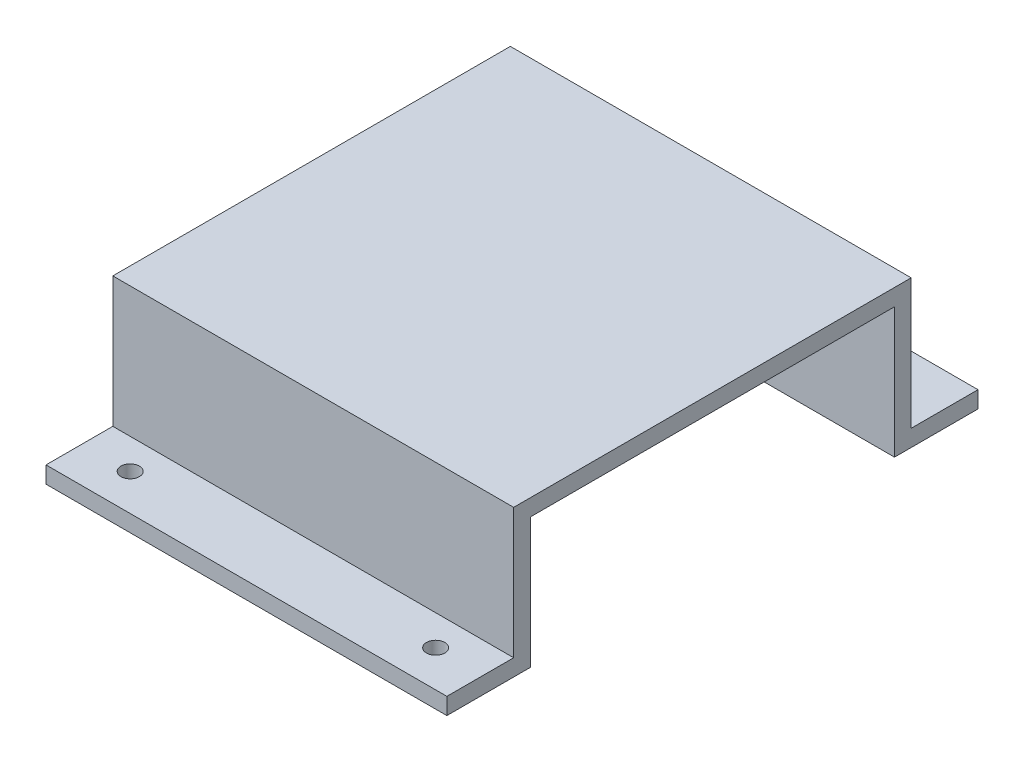
ISO-10303-21;
HEADER;
FILE_DESCRIPTION(('STEP AP214'),'2;1');
FILE_NAME('part.step','',(''),(''),'','','');
FILE_SCHEMA(('AUTOMOTIVE_DESIGN { 1 0 10303 214 1 1 1 1 }'));
ENDSEC;
DATA;
#1=APPLICATION_CONTEXT('core data for automotive mechanical design processes');
#2=APPLICATION_PROTOCOL_DEFINITION('international standard','automotive_design',2000,#1);
#3=PRODUCT_CONTEXT('',#1,'mechanical');
#4=PRODUCT('Part','Part','',(#3));
#5=PRODUCT_RELATED_PRODUCT_CATEGORY('part','',(#4));
#6=PRODUCT_DEFINITION_FORMATION('','',#4);
#7=PRODUCT_DEFINITION_CONTEXT('part definition',#1,'design');
#8=PRODUCT_DEFINITION('design','',#6,#7);
#9=PRODUCT_DEFINITION_SHAPE('','',#8);
#10=(LENGTH_UNIT() NAMED_UNIT(*) SI_UNIT(.MILLI.,.METRE.));
#11=(NAMED_UNIT(*) PLANE_ANGLE_UNIT() SI_UNIT($,.RADIAN.));
#12=(NAMED_UNIT(*) SI_UNIT($,.STERADIAN.) SOLID_ANGLE_UNIT());
#13=UNCERTAINTY_MEASURE_WITH_UNIT(LENGTH_MEASURE(1.E-05),#10,'distance_accuracy_value','');
#14=(GEOMETRIC_REPRESENTATION_CONTEXT(3) GLOBAL_UNCERTAINTY_ASSIGNED_CONTEXT((#13)) GLOBAL_UNIT_ASSIGNED_CONTEXT((#10,
#11,#12)) REPRESENTATION_CONTEXT('',''));
#15=CARTESIAN_POINT('',(0.,0.,0.));
#16=DIRECTION('',(0.,0.,1.));
#17=DIRECTION('',(1.,0.,0.));
#18=AXIS2_PLACEMENT_3D('',#15,#16,#17);
#19=CARTESIAN_POINT('',(60.,39.,54.5));
#20=DIRECTION('',(0.,0.,1.));
#21=DIRECTION('',(0.,-1.,0.));
#22=AXIS2_PLACEMENT_3D('',#19,#20,#21);
#23=PLANE('',#22);
#24=DIRECTION('',(0.,1.,0.));
#25=VECTOR('',#24,1.);
#26=CARTESIAN_POINT('',(-60.,39.,54.5));
#27=LINE('',#26,#25);
#28=CARTESIAN_POINT('',(-60.,0.,54.5));
#29=VERTEX_POINT('',#28);
#30=CARTESIAN_POINT('',(-60.,39.,54.5));
#31=VERTEX_POINT('',#30);
#32=EDGE_CURVE('E161',#29,#31,#27,.T.);
#33=ORIENTED_EDGE('',*,*,#32,.T.);
#34=DIRECTION('',(-1.,0.,0.));
#35=VECTOR('',#34,1.);
#36=CARTESIAN_POINT('',(60.,39.,54.5));
#37=LINE('',#36,#35);
#38=CARTESIAN_POINT('',(60.,39.,54.5));
#39=VERTEX_POINT('',#38);
#40=EDGE_CURVE('E11',#39,#31,#37,.T.);
#41=ORIENTED_EDGE('',*,*,#40,.F.);
#42=DIRECTION('',(0.,1.,0.));
#43=VECTOR('',#42,1.);
#44=CARTESIAN_POINT('',(60.,39.,54.5));
#45=LINE('',#44,#43);
#46=CARTESIAN_POINT('',(60.,0.,54.5));
#47=VERTEX_POINT('',#46);
#48=EDGE_CURVE('E183',#47,#39,#45,.T.);
#49=ORIENTED_EDGE('',*,*,#48,.F.);
#50=DIRECTION('',(-1.,0.,0.));
#51=VECTOR('',#50,1.);
#52=CARTESIAN_POINT('',(60.,0.,54.5));
#53=LINE('',#52,#51);
#54=EDGE_CURVE('E160',#47,#29,#53,.T.);
#55=ORIENTED_EDGE('',*,*,#54,.T.);
#56=EDGE_LOOP('',(#33,#41,#49,#55));
#57=FACE_BOUND('',#56,.T.);
#58=ADVANCED_FACE('F41',(#57),#23,.F.);
#59=CARTESIAN_POINT('',(60.,39.,0.));
#60=DIRECTION('',(0.,1.,0.));
#61=DIRECTION('',(0.,0.,1.));
#62=AXIS2_PLACEMENT_3D('',#59,#60,#61);
#63=PLANE('',#62);
#64=DIRECTION('',(0.,0.,-1.));
#65=VECTOR('',#64,1.);
#66=CARTESIAN_POINT('',(-60.,39.,0.));
#67=LINE('',#66,#65);
#68=CARTESIAN_POINT('',(-60.,39.,-54.5));
#69=VERTEX_POINT('',#68);
#70=EDGE_CURVE('E163',#31,#69,#67,.T.);
#71=ORIENTED_EDGE('',*,*,#70,.T.);
#72=DIRECTION('',(-1.,0.,0.));
#73=VECTOR('',#72,1.);
#74=CARTESIAN_POINT('',(60.,39.,-54.5));
#75=LINE('',#74,#73);
#76=CARTESIAN_POINT('',(60.,39.,-54.5));
#77=VERTEX_POINT('',#76);
#78=EDGE_CURVE('E47',#77,#69,#75,.T.);
#79=ORIENTED_EDGE('',*,*,#78,.F.);
#80=DIRECTION('',(0.,0.,-1.));
#81=VECTOR('',#80,1.);
#82=CARTESIAN_POINT('',(60.,39.,0.));
#83=LINE('',#82,#81);
#84=EDGE_CURVE('E115',#39,#77,#83,.T.);
#85=ORIENTED_EDGE('',*,*,#84,.F.);
#86=ORIENTED_EDGE('',*,*,#40,.T.);
#87=EDGE_LOOP('',(#71,#79,#85,#86));
#88=FACE_BOUND('',#87,.T.);
#89=ADVANCED_FACE('F270',(#88),#63,.F.);
#90=CARTESIAN_POINT('',(60.,39.,-54.5));
#91=DIRECTION('',(0.,0.,-1.));
#92=DIRECTION('',(0.,1.,0.));
#93=AXIS2_PLACEMENT_3D('',#90,#91,#92);
#94=PLANE('',#93);
#95=DIRECTION('',(0.,-1.,0.));
#96=VECTOR('',#95,1.);
#97=CARTESIAN_POINT('',(-60.,39.,-54.5));
#98=LINE('',#97,#96);
#99=CARTESIAN_POINT('',(-60.,0.,-54.5));
#100=VERTEX_POINT('',#99);
#101=EDGE_CURVE('E170',#69,#100,#98,.T.);
#102=ORIENTED_EDGE('',*,*,#101,.T.);
#103=DIRECTION('',(-1.,0.,0.));
#104=VECTOR('',#103,1.);
#105=CARTESIAN_POINT('',(60.,0.,-54.5));
#106=LINE('',#105,#104);
#107=CARTESIAN_POINT('',(60.,0.,-54.5));
#108=VERTEX_POINT('',#107);
#109=EDGE_CURVE('E204',#108,#100,#106,.T.);
#110=ORIENTED_EDGE('',*,*,#109,.F.);
#111=DIRECTION('',(0.,-1.,0.));
#112=VECTOR('',#111,1.);
#113=CARTESIAN_POINT('',(60.,39.,-54.5));
#114=LINE('',#113,#112);
#115=EDGE_CURVE('E215',#77,#108,#114,.T.);
#116=ORIENTED_EDGE('',*,*,#115,.F.);
#117=ORIENTED_EDGE('',*,*,#78,.T.);
#118=EDGE_LOOP('',(#102,#110,#116,#117));
#119=FACE_BOUND('',#118,.T.);
#120=ADVANCED_FACE('F209',(#119),#94,.F.);
#121=CARTESIAN_POINT('',(60.,0.,-54.5));
#122=DIRECTION('',(0.,1.,0.));
#123=DIRECTION('',(0.,0.,1.));
#124=AXIS2_PLACEMENT_3D('',#121,#122,#123);
#125=PLANE('',#124);
#126=CARTESIAN_POINT('',(45.72,0.,-68.58));
#127=DIRECTION('',(0.,1.,0.));
#128=DIRECTION('',(0.,0.,1.));
#129=AXIS2_PLACEMENT_3D('',#126,#127,#128);
#130=CIRCLE('',#129,2.74999999999997);
#131=CARTESIAN_POINT('',(45.72,0.,-65.83));
#132=VERTEX_POINT('',#131);
#133=EDGE_CURVE('E315',#132,#132,#130,.T.);
#134=ORIENTED_EDGE('',*,*,#133,.T.);
#135=EDGE_LOOP('',(#134));
#136=FACE_BOUND('',#135,.T.);
#137=CARTESIAN_POINT('',(-45.72,0.,-68.58));
#138=DIRECTION('',(0.,1.,0.));
#139=DIRECTION('',(0.,0.,1.));
#140=AXIS2_PLACEMENT_3D('',#137,#138,#139);
#141=CIRCLE('',#140,2.74999999999997);
#142=CARTESIAN_POINT('',(-45.72,0.,-65.83));
#143=VERTEX_POINT('',#142);
#144=EDGE_CURVE('E318',#143,#143,#141,.T.);
#145=ORIENTED_EDGE('',*,*,#144,.T.);
#146=EDGE_LOOP('',(#145));
#147=FACE_BOUND('',#146,.T.);
#148=DIRECTION('',(0.,0.,-1.));
#149=VECTOR('',#148,1.);
#150=CARTESIAN_POINT('',(-60.,0.,-54.5));
#151=LINE('',#150,#149);
#152=CARTESIAN_POINT('',(-60.,0.,-79.5));
#153=VERTEX_POINT('',#152);
#154=EDGE_CURVE('E166',#100,#153,#151,.T.);
#155=ORIENTED_EDGE('',*,*,#154,.T.);
#156=DIRECTION('',(-1.,0.,0.));
#157=VECTOR('',#156,1.);
#158=CARTESIAN_POINT('',(60.,0.,-79.5));
#159=LINE('',#158,#157);
#160=CARTESIAN_POINT('',(60.,0.,-79.5));
#161=VERTEX_POINT('',#160);
#162=EDGE_CURVE('E203',#161,#153,#159,.T.);
#163=ORIENTED_EDGE('',*,*,#162,.F.);
#164=DIRECTION('',(0.,0.,-1.));
#165=VECTOR('',#164,1.);
#166=CARTESIAN_POINT('',(60.,0.,-54.5));
#167=LINE('',#166,#165);
#168=EDGE_CURVE('E227',#108,#161,#167,.T.);
#169=ORIENTED_EDGE('',*,*,#168,.F.);
#170=ORIENTED_EDGE('',*,*,#109,.T.);
#171=EDGE_LOOP('',(#155,#163,#169,#170));
#172=FACE_BOUND('',#171,.T.);
#173=ADVANCED_FACE('F222',(#136,#147,#172),#125,.F.);
#174=CARTESIAN_POINT('',(60.,0.,-79.5));
#175=DIRECTION('',(0.,0.,1.));
#176=DIRECTION('',(1.,0.,0.));
#177=AXIS2_PLACEMENT_3D('',#174,#175,#176);
#178=PLANE('',#177);
#179=DIRECTION('',(0.,1.,0.));
#180=VECTOR('',#179,1.);
#181=CARTESIAN_POINT('',(-60.,0.,-79.5));
#182=LINE('',#181,#180);
#183=CARTESIAN_POINT('',(-60.,5.,-79.5));
#184=VERTEX_POINT('',#183);
#185=EDGE_CURVE('E173',#153,#184,#182,.T.);
#186=ORIENTED_EDGE('',*,*,#185,.T.);
#187=DIRECTION('',(-1.,0.,0.));
#188=VECTOR('',#187,1.);
#189=CARTESIAN_POINT('',(60.,5.,-79.5));
#190=LINE('',#189,#188);
#191=CARTESIAN_POINT('',(60.,5.,-79.5));
#192=VERTEX_POINT('',#191);
#193=EDGE_CURVE('E196',#192,#184,#190,.T.);
#194=ORIENTED_EDGE('',*,*,#193,.F.);
#195=DIRECTION('',(0.,1.,0.));
#196=VECTOR('',#195,1.);
#197=CARTESIAN_POINT('',(60.,0.,-79.5));
#198=LINE('',#197,#196);
#199=EDGE_CURVE('E230',#161,#192,#198,.T.);
#200=ORIENTED_EDGE('',*,*,#199,.F.);
#201=ORIENTED_EDGE('',*,*,#162,.T.);
#202=EDGE_LOOP('',(#186,#194,#200,#201));
#203=FACE_BOUND('',#202,.T.);
#204=ADVANCED_FACE('F223',(#203),#178,.F.);
#205=CARTESIAN_POINT('',(60.,5.,-59.5));
#206=DIRECTION('',(0.,-1.,0.));
#207=DIRECTION('',(0.,0.,-1.));
#208=AXIS2_PLACEMENT_3D('',#205,#206,#207);
#209=PLANE('',#208);
#210=CARTESIAN_POINT('',(45.72,5.,-68.58));
#211=DIRECTION('',(0.,1.,0.));
#212=DIRECTION('',(0.,0.,1.));
#213=AXIS2_PLACEMENT_3D('',#210,#211,#212);
#214=CIRCLE('',#213,2.74999999999997);
#215=CARTESIAN_POINT('',(45.72,5.,-65.83));
#216=VERTEX_POINT('',#215);
#217=EDGE_CURVE('E312',#216,#216,#214,.T.);
#218=ORIENTED_EDGE('',*,*,#217,.F.);
#219=EDGE_LOOP('',(#218));
#220=FACE_BOUND('',#219,.T.);
#221=CARTESIAN_POINT('',(-45.72,5.,-68.58));
#222=DIRECTION('',(0.,1.,0.));
#223=DIRECTION('',(0.,0.,1.));
#224=AXIS2_PLACEMENT_3D('',#221,#222,#223);
#225=CIRCLE('',#224,2.74999999999997);
#226=CARTESIAN_POINT('',(-45.72,5.,-65.83));
#227=VERTEX_POINT('',#226);
#228=EDGE_CURVE('E321',#227,#227,#225,.T.);
#229=ORIENTED_EDGE('',*,*,#228,.F.);
#230=EDGE_LOOP('',(#229));
#231=FACE_BOUND('',#230,.T.);
#232=DIRECTION('',(0.,0.,1.));
#233=VECTOR('',#232,1.);
#234=CARTESIAN_POINT('',(-60.,5.,-59.5));
#235=LINE('',#234,#233);
#236=CARTESIAN_POINT('',(-60.,5.,-59.5));
#237=VERTEX_POINT('',#236);
#238=EDGE_CURVE('E171',#184,#237,#235,.T.);
#239=ORIENTED_EDGE('',*,*,#238,.T.);
#240=DIRECTION('',(-1.,0.,0.));
#241=VECTOR('',#240,1.);
#242=CARTESIAN_POINT('',(60.,5.,-59.5));
#243=LINE('',#242,#241);
#244=CARTESIAN_POINT('',(60.,5.,-59.5));
#245=VERTEX_POINT('',#244);
#246=EDGE_CURVE('E195',#245,#237,#243,.T.);
#247=ORIENTED_EDGE('',*,*,#246,.F.);
#248=DIRECTION('',(0.,0.,1.));
#249=VECTOR('',#248,1.);
#250=CARTESIAN_POINT('',(60.,5.,-59.5));
#251=LINE('',#250,#249);
#252=EDGE_CURVE('E229',#192,#245,#251,.T.);
#253=ORIENTED_EDGE('',*,*,#252,.F.);
#254=ORIENTED_EDGE('',*,*,#193,.T.);
#255=EDGE_LOOP('',(#239,#247,#253,#254));
#256=FACE_BOUND('',#255,.T.);
#257=ADVANCED_FACE('F283',(#220,#231,#256),#209,.F.);
#258=CARTESIAN_POINT('',(60.,44.,-59.5));
#259=DIRECTION('',(0.,0.,1.));
#260=DIRECTION('',(0.,-1.,0.));
#261=AXIS2_PLACEMENT_3D('',#258,#259,#260);
#262=PLANE('',#261);
#263=DIRECTION('',(0.,1.,0.));
#264=VECTOR('',#263,1.);
#265=CARTESIAN_POINT('',(-60.,44.,-59.5));
#266=LINE('',#265,#264);
#267=CARTESIAN_POINT('',(-60.,44.,-59.5));
#268=VERTEX_POINT('',#267);
#269=EDGE_CURVE('E172',#237,#268,#266,.T.);
#270=ORIENTED_EDGE('',*,*,#269,.T.);
#271=DIRECTION('',(-1.,0.,0.));
#272=VECTOR('',#271,1.);
#273=CARTESIAN_POINT('',(60.,44.,-59.5));
#274=LINE('',#273,#272);
#275=CARTESIAN_POINT('',(60.,44.,-59.5));
#276=VERTEX_POINT('',#275);
#277=EDGE_CURVE('E192',#276,#268,#274,.T.);
#278=ORIENTED_EDGE('',*,*,#277,.F.);
#279=DIRECTION('',(0.,1.,0.));
#280=VECTOR('',#279,1.);
#281=CARTESIAN_POINT('',(60.,44.,-59.5));
#282=LINE('',#281,#280);
#283=EDGE_CURVE('E232',#245,#276,#282,.T.);
#284=ORIENTED_EDGE('',*,*,#283,.F.);
#285=ORIENTED_EDGE('',*,*,#246,.T.);
#286=EDGE_LOOP('',(#270,#278,#284,#285));
#287=FACE_BOUND('',#286,.T.);
#288=ADVANCED_FACE('F284',(#287),#262,.F.);
#289=CARTESIAN_POINT('',(60.,44.,0.));
#290=DIRECTION('',(0.,-1.,0.));
#291=DIRECTION('',(0.,0.,-1.));
#292=AXIS2_PLACEMENT_3D('',#289,#290,#291);
#293=PLANE('',#292);
#294=DIRECTION('',(0.,0.,1.));
#295=VECTOR('',#294,1.);
#296=CARTESIAN_POINT('',(-60.,44.,0.));
#297=LINE('',#296,#295);
#298=CARTESIAN_POINT('',(-60.,44.,59.5));
#299=VERTEX_POINT('',#298);
#300=EDGE_CURVE('E179',#268,#299,#297,.T.);
#301=ORIENTED_EDGE('',*,*,#300,.T.);
#302=DIRECTION('',(-1.,0.,0.));
#303=VECTOR('',#302,1.);
#304=CARTESIAN_POINT('',(60.,44.,59.5));
#305=LINE('',#304,#303);
#306=CARTESIAN_POINT('',(60.,44.,59.5));
#307=VERTEX_POINT('',#306);
#308=EDGE_CURVE('E189',#307,#299,#305,.T.);
#309=ORIENTED_EDGE('',*,*,#308,.F.);
#310=DIRECTION('',(0.,0.,1.));
#311=VECTOR('',#310,1.);
#312=CARTESIAN_POINT('',(60.,44.,0.));
#313=LINE('',#312,#311);
#314=EDGE_CURVE('E236',#276,#307,#313,.T.);
#315=ORIENTED_EDGE('',*,*,#314,.F.);
#316=ORIENTED_EDGE('',*,*,#277,.T.);
#317=EDGE_LOOP('',(#301,#309,#315,#316));
#318=FACE_BOUND('',#317,.T.);
#319=ADVANCED_FACE('F244',(#318),#293,.F.);
#320=CARTESIAN_POINT('',(60.,44.,59.5));
#321=DIRECTION('',(0.,0.,-1.));
#322=DIRECTION('',(0.,1.,0.));
#323=AXIS2_PLACEMENT_3D('',#320,#321,#322);
#324=PLANE('',#323);
#325=DIRECTION('',(0.,-1.,0.));
#326=VECTOR('',#325,1.);
#327=CARTESIAN_POINT('',(-60.,44.,59.5));
#328=LINE('',#327,#326);
#329=CARTESIAN_POINT('',(-60.,5.,59.5));
#330=VERTEX_POINT('',#329);
#331=EDGE_CURVE('E180',#299,#330,#328,.T.);
#332=ORIENTED_EDGE('',*,*,#331,.T.);
#333=DIRECTION('',(-1.,0.,0.));
#334=VECTOR('',#333,1.);
#335=CARTESIAN_POINT('',(60.,5.,59.5));
#336=LINE('',#335,#334);
#337=CARTESIAN_POINT('',(60.,5.,59.5));
#338=VERTEX_POINT('',#337);
#339=EDGE_CURVE('E155',#338,#330,#336,.T.);
#340=ORIENTED_EDGE('',*,*,#339,.F.);
#341=DIRECTION('',(0.,-1.,0.));
#342=VECTOR('',#341,1.);
#343=CARTESIAN_POINT('',(60.,44.,59.5));
#344=LINE('',#343,#342);
#345=EDGE_CURVE('E141',#307,#338,#344,.T.);
#346=ORIENTED_EDGE('',*,*,#345,.F.);
#347=ORIENTED_EDGE('',*,*,#308,.T.);
#348=EDGE_LOOP('',(#332,#340,#346,#347));
#349=FACE_BOUND('',#348,.T.);
#350=ADVANCED_FACE('F247',(#349),#324,.F.);
#351=CARTESIAN_POINT('',(60.,5.,59.5));
#352=DIRECTION('',(0.,-1.,0.));
#353=DIRECTION('',(0.,0.,-1.));
#354=AXIS2_PLACEMENT_3D('',#351,#352,#353);
#355=PLANE('',#354);
#356=CARTESIAN_POINT('',(-45.72,5.,68.5800000000013));
#357=DIRECTION('',(0.,1.,0.));
#358=DIRECTION('',(0.,0.,1.));
#359=AXIS2_PLACEMENT_3D('',#356,#357,#358);
#360=CIRCLE('',#359,2.74999999999997);
#361=CARTESIAN_POINT('',(-45.72,5.,71.3300000000012));
#362=VERTEX_POINT('',#361);
#363=EDGE_CURVE('E299',#362,#362,#360,.T.);
#364=ORIENTED_EDGE('',*,*,#363,.F.);
#365=EDGE_LOOP('',(#364));
#366=FACE_BOUND('',#365,.T.);
#367=CARTESIAN_POINT('',(45.72,5.,68.58));
#368=DIRECTION('',(0.,1.,0.));
#369=DIRECTION('',(0.,0.,1.));
#370=AXIS2_PLACEMENT_3D('',#367,#368,#369);
#371=CIRCLE('',#370,2.74999999999997);
#372=CARTESIAN_POINT('',(45.72,5.,71.33));
#373=VERTEX_POINT('',#372);
#374=EDGE_CURVE('E302',#373,#373,#371,.T.);
#375=ORIENTED_EDGE('',*,*,#374,.F.);
#376=EDGE_LOOP('',(#375));
#377=FACE_BOUND('',#376,.T.);
#378=DIRECTION('',(0.,0.,1.));
#379=VECTOR('',#378,1.);
#380=CARTESIAN_POINT('',(-60.,5.,59.5));
#381=LINE('',#380,#379);
#382=CARTESIAN_POINT('',(-60.,5.,79.5));
#383=VERTEX_POINT('',#382);
#384=EDGE_CURVE('E151',#330,#383,#381,.T.);
#385=ORIENTED_EDGE('',*,*,#384,.T.);
#386=DIRECTION('',(-1.,0.,0.));
#387=VECTOR('',#386,1.);
#388=CARTESIAN_POINT('',(60.,5.,79.5));
#389=LINE('',#388,#387);
#390=CARTESIAN_POINT('',(60.,5.,79.5));
#391=VERTEX_POINT('',#390);
#392=EDGE_CURVE('E146',#391,#383,#389,.T.);
#393=ORIENTED_EDGE('',*,*,#392,.F.);
#394=DIRECTION('',(0.,0.,1.));
#395=VECTOR('',#394,1.);
#396=CARTESIAN_POINT('',(60.,5.,59.5));
#397=LINE('',#396,#395);
#398=EDGE_CURVE('E137',#338,#391,#397,.T.);
#399=ORIENTED_EDGE('',*,*,#398,.F.);
#400=ORIENTED_EDGE('',*,*,#339,.T.);
#401=EDGE_LOOP('',(#385,#393,#399,#400));
#402=FACE_BOUND('',#401,.T.);
#403=ADVANCED_FACE('F149',(#366,#377,#402),#355,.F.);
#404=CARTESIAN_POINT('',(60.,0.,79.5));
#405=DIRECTION('',(0.,0.,-1.));
#406=DIRECTION('',(-1.,0.,0.));
#407=AXIS2_PLACEMENT_3D('',#404,#405,#406);
#408=PLANE('',#407);
#409=DIRECTION('',(0.,-1.,0.));
#410=VECTOR('',#409,1.);
#411=CARTESIAN_POINT('',(-60.,0.,79.5));
#412=LINE('',#411,#410);
#413=CARTESIAN_POINT('',(-60.,0.,79.5));
#414=VERTEX_POINT('',#413);
#415=EDGE_CURVE('E98',#383,#414,#412,.T.);
#416=ORIENTED_EDGE('',*,*,#415,.T.);
#417=DIRECTION('',(-1.,0.,0.));
#418=VECTOR('',#417,1.);
#419=CARTESIAN_POINT('',(60.,0.,79.5));
#420=LINE('',#419,#418);
#421=CARTESIAN_POINT('',(60.,0.,79.5));
#422=VERTEX_POINT('',#421);
#423=EDGE_CURVE('E153',#422,#414,#420,.T.);
#424=ORIENTED_EDGE('',*,*,#423,.F.);
#425=DIRECTION('',(0.,-1.,0.));
#426=VECTOR('',#425,1.);
#427=CARTESIAN_POINT('',(60.,0.,79.5));
#428=LINE('',#427,#426);
#429=EDGE_CURVE('E143',#391,#422,#428,.T.);
#430=ORIENTED_EDGE('',*,*,#429,.F.);
#431=ORIENTED_EDGE('',*,*,#392,.T.);
#432=EDGE_LOOP('',(#416,#424,#430,#431));
#433=FACE_BOUND('',#432,.T.);
#434=ADVANCED_FACE('F154',(#433),#408,.F.);
#435=CARTESIAN_POINT('',(60.,0.,54.5));
#436=DIRECTION('',(0.,1.,0.));
#437=DIRECTION('',(0.,0.,1.));
#438=AXIS2_PLACEMENT_3D('',#435,#436,#437);
#439=PLANE('',#438);
#440=CARTESIAN_POINT('',(-45.72,0.,68.5800000000013));
#441=DIRECTION('',(0.,1.,0.));
#442=DIRECTION('',(0.,0.,1.));
#443=AXIS2_PLACEMENT_3D('',#440,#441,#442);
#444=CIRCLE('',#443,2.74999999999997);
#445=CARTESIAN_POINT('',(-45.72,0.,71.3300000000012));
#446=VERTEX_POINT('',#445);
#447=EDGE_CURVE('E307',#446,#446,#444,.T.);
#448=ORIENTED_EDGE('',*,*,#447,.T.);
#449=EDGE_LOOP('',(#448));
#450=FACE_BOUND('',#449,.T.);
#451=CARTESIAN_POINT('',(45.72,0.,68.58));
#452=DIRECTION('',(0.,1.,0.));
#453=DIRECTION('',(0.,0.,1.));
#454=AXIS2_PLACEMENT_3D('',#451,#452,#453);
#455=CIRCLE('',#454,2.74999999999997);
#456=CARTESIAN_POINT('',(45.72,0.,71.33));
#457=VERTEX_POINT('',#456);
#458=EDGE_CURVE('E164',#457,#457,#455,.T.);
#459=ORIENTED_EDGE('',*,*,#458,.T.);
#460=EDGE_LOOP('',(#459));
#461=FACE_BOUND('',#460,.T.);
#462=DIRECTION('',(0.,0.,-1.));
#463=VECTOR('',#462,1.);
#464=CARTESIAN_POINT('',(-60.,0.,54.5));
#465=LINE('',#464,#463);
#466=EDGE_CURVE('E102',#414,#29,#465,.T.);
#467=ORIENTED_EDGE('',*,*,#466,.T.);
#468=ORIENTED_EDGE('',*,*,#54,.F.);
#469=DIRECTION('',(0.,0.,-1.));
#470=VECTOR('',#469,1.);
#471=CARTESIAN_POINT('',(60.,0.,54.5));
#472=LINE('',#471,#470);
#473=EDGE_CURVE('E60',#422,#47,#472,.T.);
#474=ORIENTED_EDGE('',*,*,#473,.F.);
#475=ORIENTED_EDGE('',*,*,#423,.T.);
#476=EDGE_LOOP('',(#467,#468,#474,#475));
#477=FACE_BOUND('',#476,.T.);
#478=ADVANCED_FACE('F253',(#450,#461,#477),#439,.F.);
#479=CARTESIAN_POINT('',(60.,0.,0.));
#480=DIRECTION('',(-1.,0.,0.));
#481=DIRECTION('',(0.,0.,1.));
#482=AXIS2_PLACEMENT_3D('',#479,#480,#481);
#483=PLANE('',#482);
#484=ORIENTED_EDGE('',*,*,#48,.T.);
#485=ORIENTED_EDGE('',*,*,#84,.T.);
#486=ORIENTED_EDGE('',*,*,#115,.T.);
#487=ORIENTED_EDGE('',*,*,#168,.T.);
#488=ORIENTED_EDGE('',*,*,#199,.T.);
#489=ORIENTED_EDGE('',*,*,#252,.T.);
#490=ORIENTED_EDGE('',*,*,#283,.T.);
#491=ORIENTED_EDGE('',*,*,#314,.T.);
#492=ORIENTED_EDGE('',*,*,#345,.T.);
#493=ORIENTED_EDGE('',*,*,#398,.T.);
#494=ORIENTED_EDGE('',*,*,#429,.T.);
#495=ORIENTED_EDGE('',*,*,#473,.T.);
#496=EDGE_LOOP('',(#484,#485,#486,#487,#488,#489,#490,#491,#492,#493,#494,#495));
#497=FACE_BOUND('',#496,.T.);
#498=ADVANCED_FACE('F138',(#497),#483,.F.);
#499=CARTESIAN_POINT('',(-60.,0.,0.));
#500=DIRECTION('',(-1.,0.,0.));
#501=DIRECTION('',(0.,0.,1.));
#502=AXIS2_PLACEMENT_3D('',#499,#500,#501);
#503=PLANE('',#502);
#504=ORIENTED_EDGE('',*,*,#32,.F.);
#505=ORIENTED_EDGE('',*,*,#466,.F.);
#506=ORIENTED_EDGE('',*,*,#415,.F.);
#507=ORIENTED_EDGE('',*,*,#384,.F.);
#508=ORIENTED_EDGE('',*,*,#331,.F.);
#509=ORIENTED_EDGE('',*,*,#300,.F.);
#510=ORIENTED_EDGE('',*,*,#269,.F.);
#511=ORIENTED_EDGE('',*,*,#238,.F.);
#512=ORIENTED_EDGE('',*,*,#185,.F.);
#513=ORIENTED_EDGE('',*,*,#154,.F.);
#514=ORIENTED_EDGE('',*,*,#101,.F.);
#515=ORIENTED_EDGE('',*,*,#70,.F.);
#516=EDGE_LOOP('',(#504,#505,#506,#507,#508,#509,#510,#511,#512,#513,#514,#515));
#517=FACE_BOUND('',#516,.T.);
#518=ADVANCED_FACE('F216',(#517),#503,.T.);
#519=CARTESIAN_POINT('',(45.72,0.,68.58));
#520=DIRECTION('',(0.,1.,0.));
#521=DIRECTION('',(0.,0.,1.));
#522=AXIS2_PLACEMENT_3D('',#519,#520,#521);
#523=CYLINDRICAL_SURFACE('',#522,2.74999999999997);
#524=ORIENTED_EDGE('',*,*,#458,.F.);
#525=EDGE_LOOP('',(#524));
#526=FACE_BOUND('',#525,.T.);
#527=ORIENTED_EDGE('',*,*,#374,.T.);
#528=EDGE_LOOP('',(#527));
#529=FACE_BOUND('',#528,.T.);
#530=ADVANCED_FACE('F329',(#526,#529),#523,.F.);
#531=CARTESIAN_POINT('',(-45.72,0.,68.5800000000013));
#532=DIRECTION('',(0.,1.,0.));
#533=DIRECTION('',(0.,0.,1.));
#534=AXIS2_PLACEMENT_3D('',#531,#532,#533);
#535=CYLINDRICAL_SURFACE('',#534,2.74999999999997);
#536=ORIENTED_EDGE('',*,*,#447,.F.);
#537=EDGE_LOOP('',(#536));
#538=FACE_BOUND('',#537,.T.);
#539=ORIENTED_EDGE('',*,*,#363,.T.);
#540=EDGE_LOOP('',(#539));
#541=FACE_BOUND('',#540,.T.);
#542=ADVANCED_FACE('F326',(#538,#541),#535,.F.);
#543=CARTESIAN_POINT('',(-45.72,0.,-68.58));
#544=DIRECTION('',(0.,1.,0.));
#545=DIRECTION('',(0.,0.,1.));
#546=AXIS2_PLACEMENT_3D('',#543,#544,#545);
#547=CYLINDRICAL_SURFACE('',#546,2.74999999999997);
#548=ORIENTED_EDGE('',*,*,#144,.F.);
#549=EDGE_LOOP('',(#548));
#550=FACE_BOUND('',#549,.T.);
#551=ORIENTED_EDGE('',*,*,#228,.T.);
#552=EDGE_LOOP('',(#551));
#553=FACE_BOUND('',#552,.T.);
#554=ADVANCED_FACE('F328',(#550,#553),#547,.F.);
#555=CARTESIAN_POINT('',(45.72,0.,-68.58));
#556=DIRECTION('',(0.,1.,0.));
#557=DIRECTION('',(0.,0.,1.));
#558=AXIS2_PLACEMENT_3D('',#555,#556,#557);
#559=CYLINDRICAL_SURFACE('',#558,2.74999999999997);
#560=ORIENTED_EDGE('',*,*,#133,.F.);
#561=EDGE_LOOP('',(#560));
#562=FACE_BOUND('',#561,.T.);
#563=ORIENTED_EDGE('',*,*,#217,.T.);
#564=EDGE_LOOP('',(#563));
#565=FACE_BOUND('',#564,.T.);
#566=ADVANCED_FACE('F333',(#562,#565),#559,.F.);
#567=CLOSED_SHELL('',(#58,#89,#120,#173,#204,#257,#288,#319,#350,#403,#434,#478,#498,#518,#530,
#542,#554,#566));
#568=MANIFOLD_SOLID_BREP('B2',#567);
#569=ADVANCED_BREP_SHAPE_REPRESENTATION('',(#18,#568),#14);
#570=SHAPE_DEFINITION_REPRESENTATION(#9,#569);
ENDSEC;
END-ISO-10303-21;
